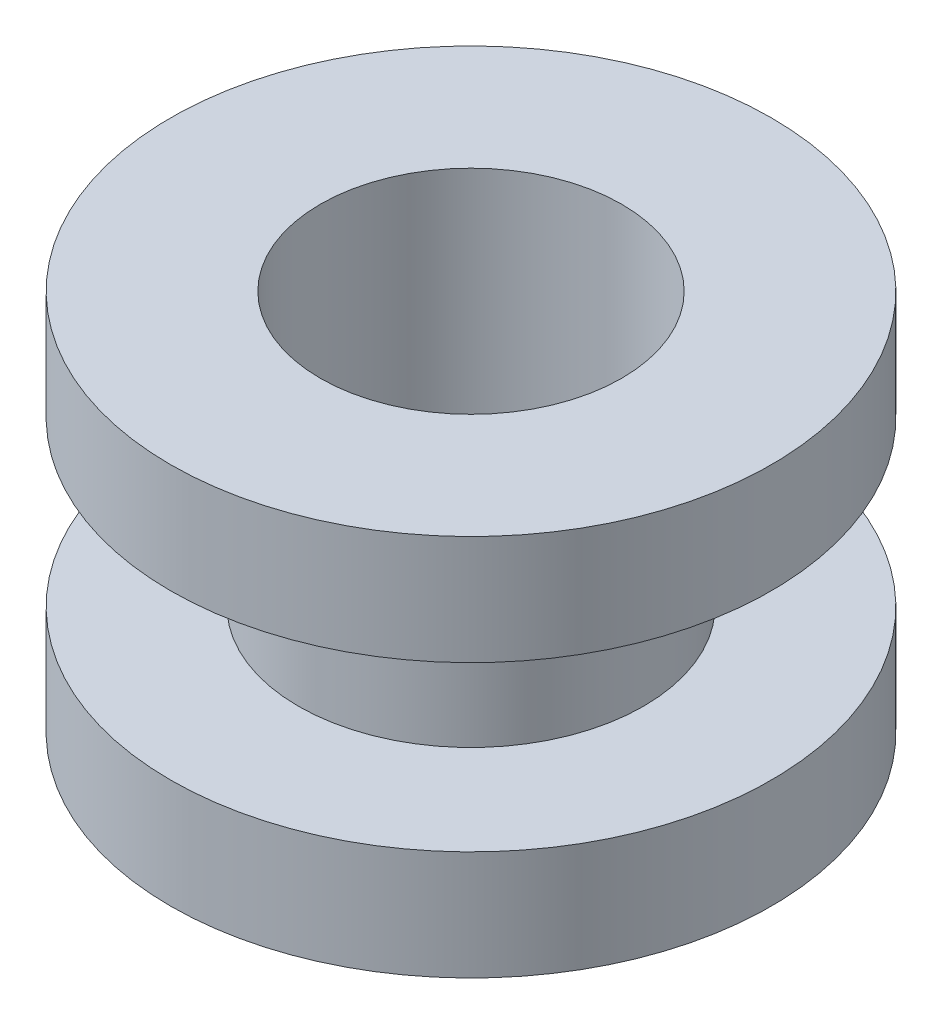
ISO-10303-21;
HEADER;
FILE_DESCRIPTION(('STEP AP214'),'2;1');
FILE_NAME('part.step','',(''),(''),'','','');
FILE_SCHEMA(('AUTOMOTIVE_DESIGN { 1 0 10303 214 1 1 1 1 }'));
ENDSEC;
DATA;
#1=APPLICATION_CONTEXT('core data for automotive mechanical design processes');
#2=APPLICATION_PROTOCOL_DEFINITION('international standard','automotive_design',2000,#1);
#3=PRODUCT_CONTEXT('',#1,'mechanical');
#4=PRODUCT('Part','Part','',(#3));
#5=PRODUCT_RELATED_PRODUCT_CATEGORY('part','',(#4));
#6=PRODUCT_DEFINITION_FORMATION('','',#4);
#7=PRODUCT_DEFINITION_CONTEXT('part definition',#1,'design');
#8=PRODUCT_DEFINITION('design','',#6,#7);
#9=PRODUCT_DEFINITION_SHAPE('','',#8);
#10=(LENGTH_UNIT() NAMED_UNIT(*) SI_UNIT(.MILLI.,.METRE.));
#11=(NAMED_UNIT(*) PLANE_ANGLE_UNIT() SI_UNIT($,.RADIAN.));
#12=(NAMED_UNIT(*) SI_UNIT($,.STERADIAN.) SOLID_ANGLE_UNIT());
#13=UNCERTAINTY_MEASURE_WITH_UNIT(LENGTH_MEASURE(1.E-05),#10,'distance_accuracy_value','');
#14=(GEOMETRIC_REPRESENTATION_CONTEXT(3) GLOBAL_UNCERTAINTY_ASSIGNED_CONTEXT((#13)) GLOBAL_UNIT_ASSIGNED_CONTEXT((#10,
#11,#12)) REPRESENTATION_CONTEXT('',''));
#15=CARTESIAN_POINT('',(0.,0.,0.));
#16=DIRECTION('',(0.,0.,1.));
#17=DIRECTION('',(1.,0.,0.));
#18=AXIS2_PLACEMENT_3D('',#15,#16,#17);
#19=CARTESIAN_POINT('',(0.,44.45,0.));
#20=DIRECTION('',(0.,-1.,0.));
#21=DIRECTION('',(0.,0.,-1.));
#22=AXIS2_PLACEMENT_3D('',#19,#20,#21);
#23=CYLINDRICAL_SURFACE('',#22,20.066);
#24=CARTESIAN_POINT('',(0.,31.75,0.));
#25=DIRECTION('',(0.,1.,0.));
#26=DIRECTION('',(0.,0.,1.));
#27=AXIS2_PLACEMENT_3D('',#24,#25,#26);
#28=CIRCLE('',#27,20.066);
#29=CARTESIAN_POINT('',(0.,31.75,20.066));
#30=VERTEX_POINT('',#29);
#31=EDGE_CURVE('E35',#30,#30,#28,.T.);
#32=ORIENTED_EDGE('',*,*,#31,.F.);
#33=EDGE_LOOP('',(#32));
#34=FACE_BOUND('',#33,.T.);
#35=CARTESIAN_POINT('',(0.,12.7,0.));
#36=DIRECTION('',(0.,-1.,0.));
#37=DIRECTION('',(0.,0.,-1.));
#38=AXIS2_PLACEMENT_3D('',#35,#36,#37);
#39=CIRCLE('',#38,20.066);
#40=CARTESIAN_POINT('',(0.,12.7,-20.066));
#41=VERTEX_POINT('',#40);
#42=EDGE_CURVE('E10',#41,#41,#39,.T.);
#43=ORIENTED_EDGE('',*,*,#42,.F.);
#44=EDGE_LOOP('',(#43));
#45=FACE_BOUND('',#44,.T.);
#46=ADVANCED_FACE('F28',(#34,#45),#23,.T.);
#47=CARTESIAN_POINT('',(0.,44.45,0.));
#48=DIRECTION('',(0.,1.,0.));
#49=DIRECTION('',(0.,0.,1.));
#50=AXIS2_PLACEMENT_3D('',#47,#48,#49);
#51=PLANE('',#50);
#52=CARTESIAN_POINT('',(0.,44.45,0.));
#53=DIRECTION('',(0.,1.,0.));
#54=DIRECTION('',(0.,0.,1.));
#55=AXIS2_PLACEMENT_3D('',#52,#53,#54);
#56=CIRCLE('',#55,17.526);
#57=CARTESIAN_POINT('',(0.,44.45,17.526));
#58=VERTEX_POINT('',#57);
#59=EDGE_CURVE('E40',#58,#58,#56,.T.);
#60=ORIENTED_EDGE('',*,*,#59,.F.);
#61=EDGE_LOOP('',(#60));
#62=FACE_BOUND('',#61,.T.);
#63=CARTESIAN_POINT('',(0.,44.45,0.));
#64=DIRECTION('',(0.,1.,0.));
#65=DIRECTION('',(0.,0.,1.));
#66=AXIS2_PLACEMENT_3D('',#63,#64,#65);
#67=CIRCLE('',#66,34.925);
#68=CARTESIAN_POINT('',(0.,44.45,34.925));
#69=VERTEX_POINT('',#68);
#70=EDGE_CURVE('E49',#69,#69,#67,.T.);
#71=ORIENTED_EDGE('',*,*,#70,.T.);
#72=EDGE_LOOP('',(#71));
#73=FACE_BOUND('',#72,.T.);
#74=ADVANCED_FACE('F72',(#62,#73),#51,.T.);
#75=CARTESIAN_POINT('',(0.,0.,0.));
#76=DIRECTION('',(0.,1.,0.));
#77=DIRECTION('',(0.,0.,1.));
#78=AXIS2_PLACEMENT_3D('',#75,#76,#77);
#79=PLANE('',#78);
#80=CARTESIAN_POINT('',(0.,0.,0.));
#81=DIRECTION('',(0.,1.,0.));
#82=DIRECTION('',(0.,0.,1.));
#83=AXIS2_PLACEMENT_3D('',#80,#81,#82);
#84=CIRCLE('',#83,17.526);
#85=CARTESIAN_POINT('',(0.,0.,17.526));
#86=VERTEX_POINT('',#85);
#87=EDGE_CURVE('E31',#86,#86,#84,.T.);
#88=ORIENTED_EDGE('',*,*,#87,.T.);
#89=EDGE_LOOP('',(#88));
#90=FACE_BOUND('',#89,.T.);
#91=CARTESIAN_POINT('',(0.,0.,0.));
#92=DIRECTION('',(0.,-1.,0.));
#93=DIRECTION('',(0.,0.,-1.));
#94=AXIS2_PLACEMENT_3D('',#91,#92,#93);
#95=CIRCLE('',#94,34.925);
#96=CARTESIAN_POINT('',(0.,0.,-34.925));
#97=VERTEX_POINT('',#96);
#98=EDGE_CURVE('E44',#97,#97,#95,.T.);
#99=ORIENTED_EDGE('',*,*,#98,.T.);
#100=EDGE_LOOP('',(#99));
#101=FACE_BOUND('',#100,.T.);
#102=ADVANCED_FACE('F58',(#90,#101),#79,.F.);
#103=CARTESIAN_POINT('',(0.,44.45,0.));
#104=DIRECTION('',(0.,-1.,0.));
#105=DIRECTION('',(0.,0.,-1.));
#106=AXIS2_PLACEMENT_3D('',#103,#104,#105);
#107=CYLINDRICAL_SURFACE('',#106,17.526);
#108=ORIENTED_EDGE('',*,*,#87,.F.);
#109=EDGE_LOOP('',(#108));
#110=FACE_BOUND('',#109,.T.);
#111=ORIENTED_EDGE('',*,*,#59,.T.);
#112=EDGE_LOOP('',(#111));
#113=FACE_BOUND('',#112,.T.);
#114=ADVANCED_FACE('F61',(#110,#113),#107,.F.);
#115=CARTESIAN_POINT('',(0.,31.75,0.));
#116=DIRECTION('',(0.,1.,0.));
#117=DIRECTION('',(0.,0.,1.));
#118=AXIS2_PLACEMENT_3D('',#115,#116,#117);
#119=PLANE('',#118);
#120=CARTESIAN_POINT('',(0.,31.75,0.));
#121=DIRECTION('',(0.,1.,0.));
#122=DIRECTION('',(0.,0.,1.));
#123=AXIS2_PLACEMENT_3D('',#120,#121,#122);
#124=CIRCLE('',#123,34.925);
#125=CARTESIAN_POINT('',(0.,31.75,34.925));
#126=VERTEX_POINT('',#125);
#127=EDGE_CURVE('E46',#126,#126,#124,.T.);
#128=ORIENTED_EDGE('',*,*,#127,.F.);
#129=EDGE_LOOP('',(#128));
#130=FACE_BOUND('',#129,.T.);
#131=ORIENTED_EDGE('',*,*,#31,.T.);
#132=EDGE_LOOP('',(#131));
#133=FACE_BOUND('',#132,.T.);
#134=ADVANCED_FACE('F63',(#130,#133),#119,.F.);
#135=CARTESIAN_POINT('',(0.,31.75,0.));
#136=DIRECTION('',(0.,1.,0.));
#137=DIRECTION('',(0.,0.,1.));
#138=AXIS2_PLACEMENT_3D('',#135,#136,#137);
#139=CYLINDRICAL_SURFACE('',#138,34.925);
#140=ORIENTED_EDGE('',*,*,#127,.T.);
#141=EDGE_LOOP('',(#140));
#142=FACE_BOUND('',#141,.T.);
#143=ORIENTED_EDGE('',*,*,#70,.F.);
#144=EDGE_LOOP('',(#143));
#145=FACE_BOUND('',#144,.T.);
#146=ADVANCED_FACE('F69',(#142,#145),#139,.T.);
#147=CARTESIAN_POINT('',(0.,12.7,0.));
#148=DIRECTION('',(0.,-1.,0.));
#149=DIRECTION('',(0.,0.,-1.));
#150=AXIS2_PLACEMENT_3D('',#147,#148,#149);
#151=PLANE('',#150);
#152=CARTESIAN_POINT('',(0.,12.7,0.));
#153=DIRECTION('',(0.,-1.,0.));
#154=DIRECTION('',(0.,0.,-1.));
#155=AXIS2_PLACEMENT_3D('',#152,#153,#154);
#156=CIRCLE('',#155,34.925);
#157=CARTESIAN_POINT('',(0.,12.7,-34.925));
#158=VERTEX_POINT('',#157);
#159=EDGE_CURVE('E51',#158,#158,#156,.T.);
#160=ORIENTED_EDGE('',*,*,#159,.F.);
#161=EDGE_LOOP('',(#160));
#162=FACE_BOUND('',#161,.T.);
#163=ORIENTED_EDGE('',*,*,#42,.T.);
#164=EDGE_LOOP('',(#163));
#165=FACE_BOUND('',#164,.T.);
#166=ADVANCED_FACE('F90',(#162,#165),#151,.F.);
#167=CARTESIAN_POINT('',(0.,12.7,0.));
#168=DIRECTION('',(0.,-1.,0.));
#169=DIRECTION('',(0.,0.,-1.));
#170=AXIS2_PLACEMENT_3D('',#167,#168,#169);
#171=CYLINDRICAL_SURFACE('',#170,34.925);
#172=ORIENTED_EDGE('',*,*,#159,.T.);
#173=EDGE_LOOP('',(#172));
#174=FACE_BOUND('',#173,.T.);
#175=ORIENTED_EDGE('',*,*,#98,.F.);
#176=EDGE_LOOP('',(#175));
#177=FACE_BOUND('',#176,.T.);
#178=ADVANCED_FACE('F95',(#174,#177),#171,.T.);
#179=CLOSED_SHELL('',(#46,#74,#102,#114,#134,#146,#166,#178));
#180=MANIFOLD_SOLID_BREP('B2',#179);
#181=ADVANCED_BREP_SHAPE_REPRESENTATION('',(#18,#180),#14);
#182=SHAPE_DEFINITION_REPRESENTATION(#9,#181);
ENDSEC;
END-ISO-10303-21;
